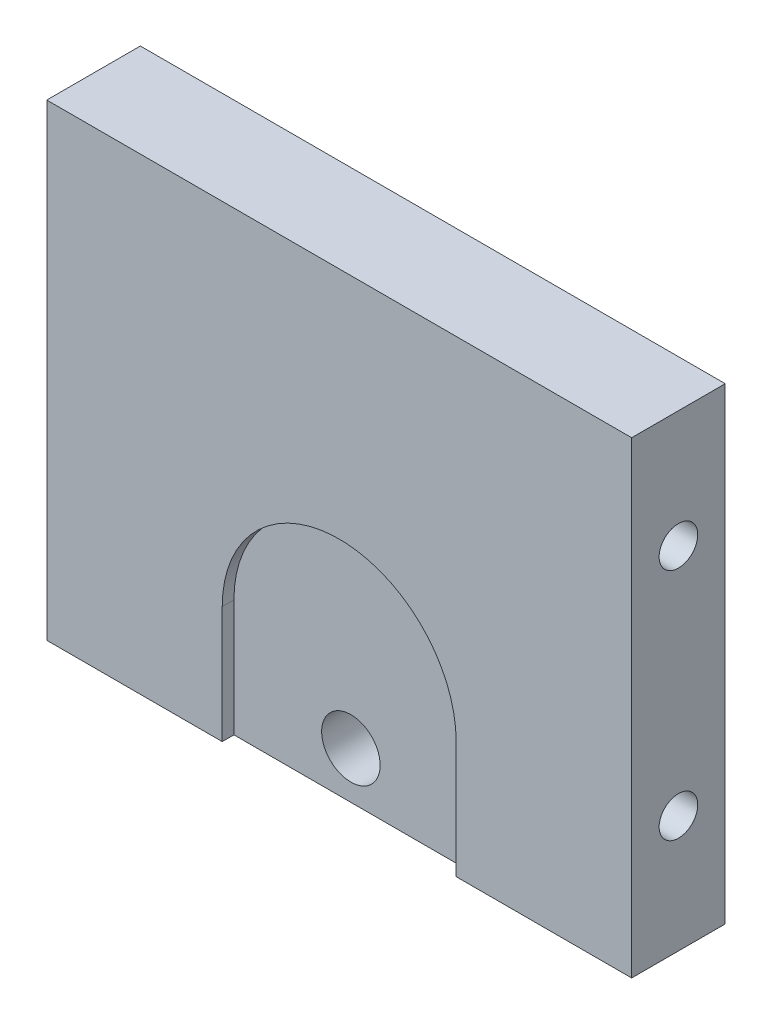
ISO-10303-21;
HEADER;
FILE_DESCRIPTION(('STEP AP214'),'2;1');
FILE_NAME('part.step','',(''),(''),'','','');
FILE_SCHEMA(('AUTOMOTIVE_DESIGN { 1 0 10303 214 1 1 1 1 }'));
ENDSEC;
DATA;
#1=APPLICATION_CONTEXT('core data for automotive mechanical design processes');
#2=APPLICATION_PROTOCOL_DEFINITION('international standard','automotive_design',2000,#1);
#3=PRODUCT_CONTEXT('',#1,'mechanical');
#4=PRODUCT('Part','Part','',(#3));
#5=PRODUCT_RELATED_PRODUCT_CATEGORY('part','',(#4));
#6=PRODUCT_DEFINITION_FORMATION('','',#4);
#7=PRODUCT_DEFINITION_CONTEXT('part definition',#1,'design');
#8=PRODUCT_DEFINITION('design','',#6,#7);
#9=PRODUCT_DEFINITION_SHAPE('','',#8);
#10=(LENGTH_UNIT() NAMED_UNIT(*) SI_UNIT(.MILLI.,.METRE.));
#11=(NAMED_UNIT(*) PLANE_ANGLE_UNIT() SI_UNIT($,.RADIAN.));
#12=(NAMED_UNIT(*) SI_UNIT($,.STERADIAN.) SOLID_ANGLE_UNIT());
#13=UNCERTAINTY_MEASURE_WITH_UNIT(LENGTH_MEASURE(1.E-05),#10,'distance_accuracy_value','');
#14=(GEOMETRIC_REPRESENTATION_CONTEXT(3) GLOBAL_UNCERTAINTY_ASSIGNED_CONTEXT((#13)) GLOBAL_UNIT_ASSIGNED_CONTEXT((#10,
#11,#12)) REPRESENTATION_CONTEXT('',''));
#15=CARTESIAN_POINT('',(0.,0.,0.));
#16=DIRECTION('',(0.,0.,1.));
#17=DIRECTION('',(1.,0.,0.));
#18=AXIS2_PLACEMENT_3D('',#15,#16,#17);
#19=CARTESIAN_POINT('',(25.,20.,8.));
#20=DIRECTION('',(-1.,0.,0.));
#21=DIRECTION('',(0.,-1.,0.));
#22=AXIS2_PLACEMENT_3D('',#19,#20,#21);
#23=PLANE('',#22);
#24=CARTESIAN_POINT('',(25.,-10.,4.));
#25=DIRECTION('',(1.,0.,0.));
#26=DIRECTION('',(0.,1.,0.));
#27=AXIS2_PLACEMENT_3D('',#24,#25,#26);
#28=CIRCLE('',#27,1.65);
#29=CARTESIAN_POINT('',(25.,-8.35,4.));
#30=VERTEX_POINT('',#29);
#31=EDGE_CURVE('E142',#30,#30,#28,.T.);
#32=ORIENTED_EDGE('',*,*,#31,.F.);
#33=EDGE_LOOP('',(#32));
#34=FACE_BOUND('',#33,.T.);
#35=CARTESIAN_POINT('',(25.,9.99999999999999,4.));
#36=DIRECTION('',(1.,0.,0.));
#37=DIRECTION('',(0.,1.,0.));
#38=AXIS2_PLACEMENT_3D('',#35,#36,#37);
#39=CIRCLE('',#38,1.65);
#40=CARTESIAN_POINT('',(25.,11.65,4.));
#41=VERTEX_POINT('',#40);
#42=EDGE_CURVE('E149',#41,#41,#39,.T.);
#43=ORIENTED_EDGE('',*,*,#42,.F.);
#44=EDGE_LOOP('',(#43));
#45=FACE_BOUND('',#44,.T.);
#46=DIRECTION('',(0.,1.,0.));
#47=VECTOR('',#46,1.);
#48=CARTESIAN_POINT('',(25.,20.,0.));
#49=LINE('',#48,#47);
#50=CARTESIAN_POINT('',(25.,-20.,0.));
#51=VERTEX_POINT('',#50);
#52=CARTESIAN_POINT('',(25.,20.,0.));
#53=VERTEX_POINT('',#52);
#54=EDGE_CURVE('E155',#51,#53,#49,.T.);
#55=ORIENTED_EDGE('',*,*,#54,.T.);
#56=DIRECTION('',(0.,0.,-1.));
#57=VECTOR('',#56,1.);
#58=CARTESIAN_POINT('',(25.,20.,8.));
#59=LINE('',#58,#57);
#60=CARTESIAN_POINT('',(25.,20.,8.));
#61=VERTEX_POINT('',#60);
#62=EDGE_CURVE('E11',#61,#53,#59,.T.);
#63=ORIENTED_EDGE('',*,*,#62,.F.);
#64=DIRECTION('',(0.,1.,0.));
#65=VECTOR('',#64,1.);
#66=CARTESIAN_POINT('',(25.,20.,8.));
#67=LINE('',#66,#65);
#68=CARTESIAN_POINT('',(25.,-20.,8.));
#69=VERTEX_POINT('',#68);
#70=EDGE_CURVE('E158',#69,#61,#67,.T.);
#71=ORIENTED_EDGE('',*,*,#70,.F.);
#72=DIRECTION('',(0.,0.,-1.));
#73=VECTOR('',#72,1.);
#74=CARTESIAN_POINT('',(25.,-20.,8.));
#75=LINE('',#74,#73);
#76=EDGE_CURVE('E165',#69,#51,#75,.T.);
#77=ORIENTED_EDGE('',*,*,#76,.T.);
#78=EDGE_LOOP('',(#55,#63,#71,#77));
#79=FACE_BOUND('',#78,.T.);
#80=ADVANCED_FACE('F33',(#34,#45,#79),#23,.F.);
#81=CARTESIAN_POINT('',(-25.,20.,8.));
#82=DIRECTION('',(0.,-1.,0.));
#83=DIRECTION('',(0.,0.,-1.));
#84=AXIS2_PLACEMENT_3D('',#81,#82,#83);
#85=PLANE('',#84);
#86=DIRECTION('',(-1.,0.,0.));
#87=VECTOR('',#86,1.);
#88=CARTESIAN_POINT('',(-25.,20.,0.));
#89=LINE('',#88,#87);
#90=CARTESIAN_POINT('',(-25.,20.,0.));
#91=VERTEX_POINT('',#90);
#92=EDGE_CURVE('E168',#53,#91,#89,.T.);
#93=ORIENTED_EDGE('',*,*,#92,.T.);
#94=DIRECTION('',(0.,0.,-1.));
#95=VECTOR('',#94,1.);
#96=CARTESIAN_POINT('',(-25.,20.,8.));
#97=LINE('',#96,#95);
#98=CARTESIAN_POINT('',(-25.,20.,8.));
#99=VERTEX_POINT('',#98);
#100=EDGE_CURVE('E40',#99,#91,#97,.T.);
#101=ORIENTED_EDGE('',*,*,#100,.F.);
#102=DIRECTION('',(-1.,0.,0.));
#103=VECTOR('',#102,1.);
#104=CARTESIAN_POINT('',(-25.,20.,8.));
#105=LINE('',#104,#103);
#106=EDGE_CURVE('E84',#61,#99,#105,.T.);
#107=ORIENTED_EDGE('',*,*,#106,.F.);
#108=ORIENTED_EDGE('',*,*,#62,.T.);
#109=EDGE_LOOP('',(#93,#101,#107,#108));
#110=FACE_BOUND('',#109,.T.);
#111=ADVANCED_FACE('F204',(#110),#85,.F.);
#112=CARTESIAN_POINT('',(-25.,20.,8.));
#113=DIRECTION('',(1.,0.,0.));
#114=DIRECTION('',(0.,1.,0.));
#115=AXIS2_PLACEMENT_3D('',#112,#113,#114);
#116=PLANE('',#115);
#117=DIRECTION('',(0.,-1.,0.));
#118=VECTOR('',#117,1.);
#119=CARTESIAN_POINT('',(-25.,20.,0.));
#120=LINE('',#119,#118);
#121=CARTESIAN_POINT('',(-25.,-20.,0.));
#122=VERTEX_POINT('',#121);
#123=EDGE_CURVE('E170',#91,#122,#120,.T.);
#124=ORIENTED_EDGE('',*,*,#123,.T.);
#125=DIRECTION('',(0.,0.,-1.));
#126=VECTOR('',#125,1.);
#127=CARTESIAN_POINT('',(-25.,-20.,8.));
#128=LINE('',#127,#126);
#129=CARTESIAN_POINT('',(-25.,-20.,8.));
#130=VERTEX_POINT('',#129);
#131=EDGE_CURVE('E174',#130,#122,#128,.T.);
#132=ORIENTED_EDGE('',*,*,#131,.F.);
#133=DIRECTION('',(0.,-1.,0.));
#134=VECTOR('',#133,1.);
#135=CARTESIAN_POINT('',(-25.,20.,8.));
#136=LINE('',#135,#134);
#137=EDGE_CURVE('E161',#99,#130,#136,.T.);
#138=ORIENTED_EDGE('',*,*,#137,.F.);
#139=ORIENTED_EDGE('',*,*,#100,.T.);
#140=EDGE_LOOP('',(#124,#132,#138,#139));
#141=FACE_BOUND('',#140,.T.);
#142=ADVANCED_FACE('F179',(#141),#116,.F.);
#143=CARTESIAN_POINT('',(-25.,-20.,8.));
#144=DIRECTION('',(0.,1.,0.));
#145=DIRECTION('',(0.,0.,1.));
#146=AXIS2_PLACEMENT_3D('',#143,#144,#145);
#147=PLANE('',#146);
#148=DIRECTION('',(1.,0.,0.));
#149=VECTOR('',#148,1.);
#150=CARTESIAN_POINT('',(-10.,-20.,7.));
#151=LINE('',#150,#149);
#152=CARTESIAN_POINT('',(-10.,-20.,7.));
#153=VERTEX_POINT('',#152);
#154=CARTESIAN_POINT('',(9.99999999999999,-20.,7.));
#155=VERTEX_POINT('',#154);
#156=EDGE_CURVE('E123',#153,#155,#151,.T.);
#157=ORIENTED_EDGE('',*,*,#156,.F.);
#158=DIRECTION('',(0.,0.,1.));
#159=VECTOR('',#158,1.);
#160=CARTESIAN_POINT('',(-10.,-20.,7.));
#161=LINE('',#160,#159);
#162=CARTESIAN_POINT('',(-10.,-20.,8.));
#163=VERTEX_POINT('',#162);
#164=EDGE_CURVE('E107',#153,#163,#161,.T.);
#165=ORIENTED_EDGE('',*,*,#164,.T.);
#166=DIRECTION('',(1.,0.,0.));
#167=VECTOR('',#166,1.);
#168=CARTESIAN_POINT('',(-25.,-20.,8.));
#169=LINE('',#168,#167);
#170=EDGE_CURVE('E163',#130,#163,#169,.T.);
#171=ORIENTED_EDGE('',*,*,#170,.F.);
#172=ORIENTED_EDGE('',*,*,#131,.T.);
#173=DIRECTION('',(1.,0.,0.));
#174=VECTOR('',#173,1.);
#175=CARTESIAN_POINT('',(-25.,-20.,0.));
#176=LINE('',#175,#174);
#177=EDGE_CURVE('E77',#122,#51,#176,.T.);
#178=ORIENTED_EDGE('',*,*,#177,.T.);
#179=ORIENTED_EDGE('',*,*,#76,.F.);
#180=CARTESIAN_POINT('',(9.99999999999999,-20.,8.));
#181=VERTEX_POINT('',#180);
#182=EDGE_CURVE('E55',#181,#69,#169,.T.);
#183=ORIENTED_EDGE('',*,*,#182,.F.);
#184=DIRECTION('',(0.,0.,1.));
#185=VECTOR('',#184,1.);
#186=CARTESIAN_POINT('',(9.99999999999999,-20.,7.));
#187=LINE('',#186,#185);
#188=EDGE_CURVE('E47',#155,#181,#187,.T.);
#189=ORIENTED_EDGE('',*,*,#188,.F.);
#190=EDGE_LOOP('',(#157,#165,#171,#172,#178,#179,#183,#189));
#191=FACE_BOUND('',#190,.T.);
#192=ADVANCED_FACE('F127',(#191),#147,.F.);
#193=CARTESIAN_POINT('',(0.,0.,8.));
#194=DIRECTION('',(0.,0.,1.));
#195=DIRECTION('',(1.,0.,0.));
#196=AXIS2_PLACEMENT_3D('',#193,#194,#195);
#197=PLANE('',#196);
#198=DIRECTION('',(0.,-1.,0.));
#199=VECTOR('',#198,1.);
#200=CARTESIAN_POINT('',(-10.,-20.,8.));
#201=LINE('',#200,#199);
#202=CARTESIAN_POINT('',(-10.,-10.,8.));
#203=VERTEX_POINT('',#202);
#204=EDGE_CURVE('E113',#203,#163,#201,.T.);
#205=ORIENTED_EDGE('',*,*,#204,.F.);
#206=CARTESIAN_POINT('',(0.,-10.,8.));
#207=DIRECTION('',(0.,0.,1.));
#208=DIRECTION('',(-1.,0.,0.));
#209=AXIS2_PLACEMENT_3D('',#206,#207,#208);
#210=CIRCLE('',#209,10.);
#211=CARTESIAN_POINT('',(9.99999999999999,-10.,8.));
#212=VERTEX_POINT('',#211);
#213=EDGE_CURVE('E125',#212,#203,#210,.T.);
#214=ORIENTED_EDGE('',*,*,#213,.F.);
#215=DIRECTION('',(0.,1.,0.));
#216=VECTOR('',#215,1.);
#217=CARTESIAN_POINT('',(9.99999999999999,-20.,8.));
#218=LINE('',#217,#216);
#219=EDGE_CURVE('E135',#181,#212,#218,.T.);
#220=ORIENTED_EDGE('',*,*,#219,.F.);
#221=ORIENTED_EDGE('',*,*,#182,.T.);
#222=ORIENTED_EDGE('',*,*,#70,.T.);
#223=ORIENTED_EDGE('',*,*,#106,.T.);
#224=ORIENTED_EDGE('',*,*,#137,.T.);
#225=ORIENTED_EDGE('',*,*,#170,.T.);
#226=EDGE_LOOP('',(#205,#214,#220,#221,#222,#223,#224,#225));
#227=FACE_BOUND('',#226,.T.);
#228=ADVANCED_FACE('F187',(#227),#197,.T.);
#229=CARTESIAN_POINT('',(0.,0.,0.));
#230=DIRECTION('',(0.,0.,1.));
#231=DIRECTION('',(1.,0.,0.));
#232=AXIS2_PLACEMENT_3D('',#229,#230,#231);
#233=PLANE('',#232);
#234=CARTESIAN_POINT('',(0.,-16.,0.));
#235=DIRECTION('',(0.,0.,1.));
#236=DIRECTION('',(1.,0.,0.));
#237=AXIS2_PLACEMENT_3D('',#234,#235,#236);
#238=CIRCLE('',#237,2.5);
#239=CARTESIAN_POINT('',(2.5,-16.,0.));
#240=VERTEX_POINT('',#239);
#241=EDGE_CURVE('E136',#240,#240,#238,.T.);
#242=ORIENTED_EDGE('',*,*,#241,.T.);
#243=EDGE_LOOP('',(#242));
#244=FACE_BOUND('',#243,.T.);
#245=ORIENTED_EDGE('',*,*,#54,.F.);
#246=ORIENTED_EDGE('',*,*,#177,.F.);
#247=ORIENTED_EDGE('',*,*,#123,.F.);
#248=ORIENTED_EDGE('',*,*,#92,.F.);
#249=EDGE_LOOP('',(#245,#246,#247,#248));
#250=FACE_BOUND('',#249,.T.);
#251=ADVANCED_FACE('F183',(#244,#250),#233,.F.);
#252=CARTESIAN_POINT('',(10.,9.99999999999999,4.));
#253=DIRECTION('',(1.,0.,0.));
#254=DIRECTION('',(0.,1.,0.));
#255=AXIS2_PLACEMENT_3D('',#252,#253,#254);
#256=CYLINDRICAL_SURFACE('',#255,1.65);
#257=CARTESIAN_POINT('',(10.,9.99999999999999,4.));
#258=DIRECTION('',(1.,0.,0.));
#259=DIRECTION('',(0.,1.,0.));
#260=AXIS2_PLACEMENT_3D('',#257,#258,#259);
#261=CIRCLE('',#260,1.65);
#262=CARTESIAN_POINT('',(10.,11.65,4.));
#263=VERTEX_POINT('',#262);
#264=EDGE_CURVE('E152',#263,#263,#261,.T.);
#265=ORIENTED_EDGE('',*,*,#264,.F.);
#266=EDGE_LOOP('',(#265));
#267=FACE_BOUND('',#266,.T.);
#268=ORIENTED_EDGE('',*,*,#42,.T.);
#269=EDGE_LOOP('',(#268));
#270=FACE_BOUND('',#269,.T.);
#271=ADVANCED_FACE('F213',(#267,#270),#256,.F.);
#272=CARTESIAN_POINT('',(10.,9.99999999999999,4.));
#273=DIRECTION('',(1.,0.,0.));
#274=DIRECTION('',(0.,1.,0.));
#275=AXIS2_PLACEMENT_3D('',#272,#273,#274);
#276=PLANE('',#275);
#277=ORIENTED_EDGE('',*,*,#264,.T.);
#278=EDGE_LOOP('',(#277));
#279=FACE_BOUND('',#278,.T.);
#280=ADVANCED_FACE('F215',(#279),#276,.T.);
#281=CARTESIAN_POINT('',(10.,-10.,4.));
#282=DIRECTION('',(1.,0.,0.));
#283=DIRECTION('',(0.,1.,0.));
#284=AXIS2_PLACEMENT_3D('',#281,#282,#283);
#285=CYLINDRICAL_SURFACE('',#284,1.65);
#286=CARTESIAN_POINT('',(10.,-10.,4.));
#287=DIRECTION('',(1.,0.,0.));
#288=DIRECTION('',(0.,1.,0.));
#289=AXIS2_PLACEMENT_3D('',#286,#287,#288);
#290=CIRCLE('',#289,1.65);
#291=CARTESIAN_POINT('',(10.,-8.35000000000001,4.));
#292=VERTEX_POINT('',#291);
#293=EDGE_CURVE('E146',#292,#292,#290,.T.);
#294=ORIENTED_EDGE('',*,*,#293,.F.);
#295=EDGE_LOOP('',(#294));
#296=FACE_BOUND('',#295,.T.);
#297=ORIENTED_EDGE('',*,*,#31,.T.);
#298=EDGE_LOOP('',(#297));
#299=FACE_BOUND('',#298,.T.);
#300=ADVANCED_FACE('F222',(#296,#299),#285,.F.);
#301=CARTESIAN_POINT('',(10.,-10.,4.));
#302=DIRECTION('',(1.,0.,0.));
#303=DIRECTION('',(0.,1.,0.));
#304=AXIS2_PLACEMENT_3D('',#301,#302,#303);
#305=PLANE('',#304);
#306=ORIENTED_EDGE('',*,*,#293,.T.);
#307=EDGE_LOOP('',(#306));
#308=FACE_BOUND('',#307,.T.);
#309=ADVANCED_FACE('F294',(#308),#305,.T.);
#310=CARTESIAN_POINT('',(-10.,-20.,7.));
#311=DIRECTION('',(-1.,0.,0.));
#312=DIRECTION('',(0.,0.,1.));
#313=AXIS2_PLACEMENT_3D('',#310,#311,#312);
#314=PLANE('',#313);
#315=ORIENTED_EDGE('',*,*,#204,.T.);
#316=ORIENTED_EDGE('',*,*,#164,.F.);
#317=DIRECTION('',(0.,-1.,0.));
#318=VECTOR('',#317,1.);
#319=CARTESIAN_POINT('',(-10.,-20.,7.));
#320=LINE('',#319,#318);
#321=CARTESIAN_POINT('',(-10.,-10.,7.));
#322=VERTEX_POINT('',#321);
#323=EDGE_CURVE('E110',#322,#153,#320,.T.);
#324=ORIENTED_EDGE('',*,*,#323,.F.);
#325=DIRECTION('',(0.,0.,1.));
#326=VECTOR('',#325,1.);
#327=CARTESIAN_POINT('',(-10.,-10.,7.));
#328=LINE('',#327,#326);
#329=EDGE_CURVE('E140',#322,#203,#328,.T.);
#330=ORIENTED_EDGE('',*,*,#329,.T.);
#331=EDGE_LOOP('',(#315,#316,#324,#330));
#332=FACE_BOUND('',#331,.T.);
#333=ADVANCED_FACE('F109',(#332),#314,.F.);
#334=CARTESIAN_POINT('',(0.,-10.,7.));
#335=DIRECTION('',(0.,0.,1.));
#336=DIRECTION('',(1.,0.,0.));
#337=AXIS2_PLACEMENT_3D('',#334,#335,#336);
#338=CYLINDRICAL_SURFACE('',#337,10.);
#339=ORIENTED_EDGE('',*,*,#213,.T.);
#340=ORIENTED_EDGE('',*,*,#329,.F.);
#341=CARTESIAN_POINT('',(0.,-10.,7.));
#342=DIRECTION('',(0.,0.,1.));
#343=DIRECTION('',(-1.,0.,0.));
#344=AXIS2_PLACEMENT_3D('',#341,#342,#343);
#345=CIRCLE('',#344,10.);
#346=CARTESIAN_POINT('',(9.99999999999999,-10.,7.));
#347=VERTEX_POINT('',#346);
#348=EDGE_CURVE('E117',#347,#322,#345,.T.);
#349=ORIENTED_EDGE('',*,*,#348,.F.);
#350=DIRECTION('',(0.,0.,1.));
#351=VECTOR('',#350,1.);
#352=CARTESIAN_POINT('',(9.99999999999999,-10.,7.));
#353=LINE('',#352,#351);
#354=EDGE_CURVE('E143',#347,#212,#353,.T.);
#355=ORIENTED_EDGE('',*,*,#354,.T.);
#356=EDGE_LOOP('',(#339,#340,#349,#355));
#357=FACE_BOUND('',#356,.T.);
#358=ADVANCED_FACE('F190',(#357),#338,.F.);
#359=CARTESIAN_POINT('',(9.99999999999999,-20.,7.));
#360=DIRECTION('',(1.,0.,0.));
#361=DIRECTION('',(0.,0.,-1.));
#362=AXIS2_PLACEMENT_3D('',#359,#360,#361);
#363=PLANE('',#362);
#364=ORIENTED_EDGE('',*,*,#219,.T.);
#365=ORIENTED_EDGE('',*,*,#354,.F.);
#366=DIRECTION('',(0.,1.,0.));
#367=VECTOR('',#366,1.);
#368=CARTESIAN_POINT('',(9.99999999999999,-20.,7.));
#369=LINE('',#368,#367);
#370=EDGE_CURVE('E128',#155,#347,#369,.T.);
#371=ORIENTED_EDGE('',*,*,#370,.F.);
#372=ORIENTED_EDGE('',*,*,#188,.T.);
#373=EDGE_LOOP('',(#364,#365,#371,#372));
#374=FACE_BOUND('',#373,.T.);
#375=ADVANCED_FACE('F191',(#374),#363,.F.);
#376=CARTESIAN_POINT('',(0.,-10.,7.));
#377=DIRECTION('',(0.,0.,-1.));
#378=DIRECTION('',(-1.,0.,0.));
#379=AXIS2_PLACEMENT_3D('',#376,#377,#378);
#380=PLANE('',#379);
#381=CARTESIAN_POINT('',(0.,-16.,7.));
#382=DIRECTION('',(0.,0.,1.));
#383=DIRECTION('',(1.,0.,0.));
#384=AXIS2_PLACEMENT_3D('',#381,#382,#383);
#385=CIRCLE('',#384,2.5);
#386=CARTESIAN_POINT('',(2.5,-16.,7.));
#387=VERTEX_POINT('',#386);
#388=EDGE_CURVE('E279',#387,#387,#385,.T.);
#389=ORIENTED_EDGE('',*,*,#388,.F.);
#390=EDGE_LOOP('',(#389));
#391=FACE_BOUND('',#390,.T.);
#392=ORIENTED_EDGE('',*,*,#323,.T.);
#393=ORIENTED_EDGE('',*,*,#156,.T.);
#394=ORIENTED_EDGE('',*,*,#370,.T.);
#395=ORIENTED_EDGE('',*,*,#348,.T.);
#396=EDGE_LOOP('',(#392,#393,#394,#395));
#397=FACE_BOUND('',#396,.T.);
#398=ADVANCED_FACE('F121',(#391,#397),#380,.F.);
#399=CARTESIAN_POINT('',(0.,-16.,-3.));
#400=DIRECTION('',(0.,0.,1.));
#401=DIRECTION('',(1.,0.,0.));
#402=AXIS2_PLACEMENT_3D('',#399,#400,#401);
#403=CYLINDRICAL_SURFACE('',#402,2.5);
#404=ORIENTED_EDGE('',*,*,#388,.T.);
#405=EDGE_LOOP('',(#404));
#406=FACE_BOUND('',#405,.T.);
#407=ORIENTED_EDGE('',*,*,#241,.F.);
#408=EDGE_LOOP('',(#407));
#409=FACE_BOUND('',#408,.T.);
#410=ADVANCED_FACE('F198',(#406,#409),#403,.F.);
#411=CLOSED_SHELL('',(#80,#111,#142,#192,#228,#251,#271,#280,#300,#309,#333,#358,#375,#398,#410));
#412=MANIFOLD_SOLID_BREP('B2',#411);
#413=ADVANCED_BREP_SHAPE_REPRESENTATION('',(#18,#412),#14);
#414=SHAPE_DEFINITION_REPRESENTATION(#9,#413);
ENDSEC;
END-ISO-10303-21;
